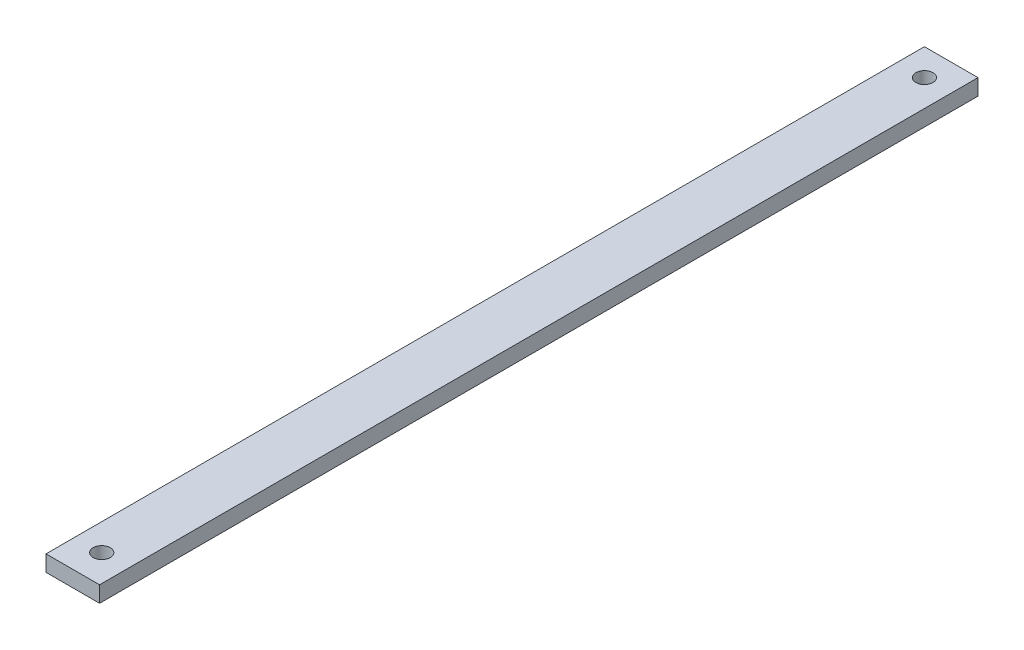
ISO-10303-21;
HEADER;
FILE_DESCRIPTION(('STEP AP214'),'2;1');
FILE_NAME('part.step','',(''),(''),'','','');
FILE_SCHEMA(('AUTOMOTIVE_DESIGN { 1 0 10303 214 1 1 1 1 }'));
ENDSEC;
DATA;
#1=APPLICATION_CONTEXT('core data for automotive mechanical design processes');
#2=APPLICATION_PROTOCOL_DEFINITION('international standard','automotive_design',2000,#1);
#3=PRODUCT_CONTEXT('',#1,'mechanical');
#4=PRODUCT('Part','Part','',(#3));
#5=PRODUCT_RELATED_PRODUCT_CATEGORY('part','',(#4));
#6=PRODUCT_DEFINITION_FORMATION('','',#4);
#7=PRODUCT_DEFINITION_CONTEXT('part definition',#1,'design');
#8=PRODUCT_DEFINITION('design','',#6,#7);
#9=PRODUCT_DEFINITION_SHAPE('','',#8);
#10=(LENGTH_UNIT() NAMED_UNIT(*) SI_UNIT(.MILLI.,.METRE.));
#11=(NAMED_UNIT(*) PLANE_ANGLE_UNIT() SI_UNIT($,.RADIAN.));
#12=(NAMED_UNIT(*) SI_UNIT($,.STERADIAN.) SOLID_ANGLE_UNIT());
#13=UNCERTAINTY_MEASURE_WITH_UNIT(LENGTH_MEASURE(1.E-05),#10,'distance_accuracy_value','');
#14=(GEOMETRIC_REPRESENTATION_CONTEXT(3) GLOBAL_UNCERTAINTY_ASSIGNED_CONTEXT((#13)) GLOBAL_UNIT_ASSIGNED_CONTEXT((#10,
#11,#12)) REPRESENTATION_CONTEXT('',''));
#15=CARTESIAN_POINT('',(0.,0.,0.));
#16=DIRECTION('',(0.,0.,1.));
#17=DIRECTION('',(1.,0.,0.));
#18=AXIS2_PLACEMENT_3D('',#15,#16,#17);
#19=CARTESIAN_POINT('',(0.,3.,0.));
#20=DIRECTION('',(1.,0.,0.));
#21=DIRECTION('',(0.,0.,-1.));
#22=AXIS2_PLACEMENT_3D('',#19,#20,#21);
#23=PLANE('',#22);
#24=DIRECTION('',(0.,0.,1.));
#25=VECTOR('',#24,1.);
#26=CARTESIAN_POINT('',(0.,0.,0.));
#27=LINE('',#26,#25);
#28=CARTESIAN_POINT('',(0.,0.,-164.));
#29=VERTEX_POINT('',#28);
#30=CARTESIAN_POINT('',(0.,0.,0.));
#31=VERTEX_POINT('',#30);
#32=EDGE_CURVE('E110',#29,#31,#27,.T.);
#33=ORIENTED_EDGE('',*,*,#32,.T.);
#34=DIRECTION('',(0.,-1.,0.));
#35=VECTOR('',#34,1.);
#36=CARTESIAN_POINT('',(0.,3.,0.));
#37=LINE('',#36,#35);
#38=CARTESIAN_POINT('',(0.,3.,0.));
#39=VERTEX_POINT('',#38);
#40=EDGE_CURVE('E11',#39,#31,#37,.T.);
#41=ORIENTED_EDGE('',*,*,#40,.F.);
#42=DIRECTION('',(0.,0.,1.));
#43=VECTOR('',#42,1.);
#44=CARTESIAN_POINT('',(0.,3.,0.));
#45=LINE('',#44,#43);
#46=CARTESIAN_POINT('',(0.,3.,-164.));
#47=VERTEX_POINT('',#46);
#48=EDGE_CURVE('E93',#47,#39,#45,.T.);
#49=ORIENTED_EDGE('',*,*,#48,.F.);
#50=DIRECTION('',(0.,-1.,0.));
#51=VECTOR('',#50,1.);
#52=CARTESIAN_POINT('',(0.,3.,-164.));
#53=LINE('',#52,#51);
#54=EDGE_CURVE('E106',#47,#29,#53,.T.);
#55=ORIENTED_EDGE('',*,*,#54,.T.);
#56=EDGE_LOOP('',(#33,#41,#49,#55));
#57=FACE_BOUND('',#56,.T.);
#58=ADVANCED_FACE('F39',(#57),#23,.F.);
#59=CARTESIAN_POINT('',(0.,3.,0.));
#60=DIRECTION('',(0.,0.,-1.));
#61=DIRECTION('',(-1.,0.,0.));
#62=AXIS2_PLACEMENT_3D('',#59,#60,#61);
#63=PLANE('',#62);
#64=DIRECTION('',(1.,0.,0.));
#65=VECTOR('',#64,1.);
#66=CARTESIAN_POINT('',(0.,0.,0.));
#67=LINE('',#66,#65);
#68=CARTESIAN_POINT('',(10.,0.,0.));
#69=VERTEX_POINT('',#68);
#70=EDGE_CURVE('E98',#31,#69,#67,.T.);
#71=ORIENTED_EDGE('',*,*,#70,.T.);
#72=DIRECTION('',(0.,-1.,0.));
#73=VECTOR('',#72,1.);
#74=CARTESIAN_POINT('',(10.,3.,0.));
#75=LINE('',#74,#73);
#76=CARTESIAN_POINT('',(10.,3.,0.));
#77=VERTEX_POINT('',#76);
#78=EDGE_CURVE('E49',#77,#69,#75,.T.);
#79=ORIENTED_EDGE('',*,*,#78,.F.);
#80=DIRECTION('',(1.,0.,0.));
#81=VECTOR('',#80,1.);
#82=CARTESIAN_POINT('',(0.,3.,0.));
#83=LINE('',#82,#81);
#84=EDGE_CURVE('E88',#39,#77,#83,.T.);
#85=ORIENTED_EDGE('',*,*,#84,.F.);
#86=ORIENTED_EDGE('',*,*,#40,.T.);
#87=EDGE_LOOP('',(#71,#79,#85,#86));
#88=FACE_BOUND('',#87,.T.);
#89=ADVANCED_FACE('F97',(#88),#63,.F.);
#90=CARTESIAN_POINT('',(10.,3.,0.));
#91=DIRECTION('',(-1.,0.,0.));
#92=DIRECTION('',(0.,0.,1.));
#93=AXIS2_PLACEMENT_3D('',#90,#91,#92);
#94=PLANE('',#93);
#95=DIRECTION('',(0.,0.,-1.));
#96=VECTOR('',#95,1.);
#97=CARTESIAN_POINT('',(10.,0.,0.));
#98=LINE('',#97,#96);
#99=CARTESIAN_POINT('',(9.99999999999997,0.,-164.));
#100=VERTEX_POINT('',#99);
#101=EDGE_CURVE('E75',#69,#100,#98,.T.);
#102=ORIENTED_EDGE('',*,*,#101,.T.);
#103=DIRECTION('',(0.,-1.,0.));
#104=VECTOR('',#103,1.);
#105=CARTESIAN_POINT('',(9.99999999999997,3.,-164.));
#106=LINE('',#105,#104);
#107=CARTESIAN_POINT('',(9.99999999999997,3.,-164.));
#108=VERTEX_POINT('',#107);
#109=EDGE_CURVE('E100',#108,#100,#106,.T.);
#110=ORIENTED_EDGE('',*,*,#109,.F.);
#111=DIRECTION('',(0.,0.,-1.));
#112=VECTOR('',#111,1.);
#113=CARTESIAN_POINT('',(10.,3.,0.));
#114=LINE('',#113,#112);
#115=EDGE_CURVE('E91',#77,#108,#114,.T.);
#116=ORIENTED_EDGE('',*,*,#115,.F.);
#117=ORIENTED_EDGE('',*,*,#78,.T.);
#118=EDGE_LOOP('',(#102,#110,#116,#117));
#119=FACE_BOUND('',#118,.T.);
#120=ADVANCED_FACE('F102',(#119),#94,.F.);
#121=CARTESIAN_POINT('',(0.,3.,-164.));
#122=DIRECTION('',(0.,0.,1.));
#123=DIRECTION('',(1.,0.,0.));
#124=AXIS2_PLACEMENT_3D('',#121,#122,#123);
#125=PLANE('',#124);
#126=DIRECTION('',(-1.,0.,0.));
#127=VECTOR('',#126,1.);
#128=CARTESIAN_POINT('',(0.,0.,-164.));
#129=LINE('',#128,#127);
#130=EDGE_CURVE('E81',#100,#29,#129,.T.);
#131=ORIENTED_EDGE('',*,*,#130,.T.);
#132=ORIENTED_EDGE('',*,*,#54,.F.);
#133=DIRECTION('',(-1.,0.,0.));
#134=VECTOR('',#133,1.);
#135=CARTESIAN_POINT('',(0.,3.,-164.));
#136=LINE('',#135,#134);
#137=EDGE_CURVE('E58',#108,#47,#136,.T.);
#138=ORIENTED_EDGE('',*,*,#137,.F.);
#139=ORIENTED_EDGE('',*,*,#109,.T.);
#140=EDGE_LOOP('',(#131,#132,#138,#139));
#141=FACE_BOUND('',#140,.T.);
#142=ADVANCED_FACE('F147',(#141),#125,.F.);
#143=CARTESIAN_POINT('',(0.,3.,0.));
#144=DIRECTION('',(0.,-1.,0.));
#145=DIRECTION('',(0.,0.,-1.));
#146=AXIS2_PLACEMENT_3D('',#143,#144,#145);
#147=PLANE('',#146);
#148=CARTESIAN_POINT('',(5.,3.,-159.));
#149=DIRECTION('',(0.,1.,0.));
#150=DIRECTION('',(0.,0.,1.));
#151=AXIS2_PLACEMENT_3D('',#148,#149,#150);
#152=CIRCLE('',#151,1.59999999999999);
#153=CARTESIAN_POINT('',(5.,3.,-157.4));
#154=VERTEX_POINT('',#153);
#155=EDGE_CURVE('E126',#154,#154,#152,.T.);
#156=ORIENTED_EDGE('',*,*,#155,.F.);
#157=EDGE_LOOP('',(#156));
#158=FACE_BOUND('',#157,.T.);
#159=CARTESIAN_POINT('',(4.99999999999997,3.,-5.40000000000002));
#160=DIRECTION('',(0.,1.,0.));
#161=DIRECTION('',(0.,0.,1.));
#162=AXIS2_PLACEMENT_3D('',#159,#160,#161);
#163=CIRCLE('',#162,1.6);
#164=CARTESIAN_POINT('',(4.99999999999997,3.,-3.80000000000002));
#165=VERTEX_POINT('',#164);
#166=EDGE_CURVE('E133',#165,#165,#163,.T.);
#167=ORIENTED_EDGE('',*,*,#166,.F.);
#168=EDGE_LOOP('',(#167));
#169=FACE_BOUND('',#168,.T.);
#170=ORIENTED_EDGE('',*,*,#48,.T.);
#171=ORIENTED_EDGE('',*,*,#84,.T.);
#172=ORIENTED_EDGE('',*,*,#115,.T.);
#173=ORIENTED_EDGE('',*,*,#137,.T.);
#174=EDGE_LOOP('',(#170,#171,#172,#173));
#175=FACE_BOUND('',#174,.T.);
#176=ADVANCED_FACE('F89',(#158,#169,#175),#147,.F.);
#177=CARTESIAN_POINT('',(0.,0.,0.));
#178=DIRECTION('',(0.,-1.,0.));
#179=DIRECTION('',(0.,0.,-1.));
#180=AXIS2_PLACEMENT_3D('',#177,#178,#179);
#181=PLANE('',#180);
#182=CARTESIAN_POINT('',(5.,0.,-159.));
#183=DIRECTION('',(0.,-1.,0.));
#184=DIRECTION('',(0.,0.,-1.));
#185=AXIS2_PLACEMENT_3D('',#182,#183,#184);
#186=CIRCLE('',#185,1.59999999999999);
#187=CARTESIAN_POINT('',(5.,0.,-160.6));
#188=VERTEX_POINT('',#187);
#189=EDGE_CURVE('E42',#188,#188,#186,.T.);
#190=ORIENTED_EDGE('',*,*,#189,.F.);
#191=EDGE_LOOP('',(#190));
#192=FACE_BOUND('',#191,.T.);
#193=CARTESIAN_POINT('',(4.99999999999997,0.,-5.40000000000002));
#194=DIRECTION('',(0.,-1.,0.));
#195=DIRECTION('',(0.,0.,-1.));
#196=AXIS2_PLACEMENT_3D('',#193,#194,#195);
#197=CIRCLE('',#196,1.6);
#198=CARTESIAN_POINT('',(4.99999999999997,0.,-7.00000000000002));
#199=VERTEX_POINT('',#198);
#200=EDGE_CURVE('E123',#199,#199,#197,.T.);
#201=ORIENTED_EDGE('',*,*,#200,.F.);
#202=EDGE_LOOP('',(#201));
#203=FACE_BOUND('',#202,.T.);
#204=ORIENTED_EDGE('',*,*,#32,.F.);
#205=ORIENTED_EDGE('',*,*,#130,.F.);
#206=ORIENTED_EDGE('',*,*,#101,.F.);
#207=ORIENTED_EDGE('',*,*,#70,.F.);
#208=EDGE_LOOP('',(#204,#205,#206,#207));
#209=FACE_BOUND('',#208,.T.);
#210=ADVANCED_FACE('F146',(#192,#203,#209),#181,.T.);
#211=CARTESIAN_POINT('',(4.99999999999997,-7.,-5.40000000000002));
#212=DIRECTION('',(0.,1.,0.));
#213=DIRECTION('',(0.,0.,1.));
#214=AXIS2_PLACEMENT_3D('',#211,#212,#213);
#215=CYLINDRICAL_SURFACE('',#214,1.6);
#216=ORIENTED_EDGE('',*,*,#200,.T.);
#217=EDGE_LOOP('',(#216));
#218=FACE_BOUND('',#217,.T.);
#219=ORIENTED_EDGE('',*,*,#166,.T.);
#220=EDGE_LOOP('',(#219));
#221=FACE_BOUND('',#220,.T.);
#222=ADVANCED_FACE('F143',(#218,#221),#215,.F.);
#223=CARTESIAN_POINT('',(5.,-7.,-159.));
#224=DIRECTION('',(0.,1.,0.));
#225=DIRECTION('',(0.,0.,1.));
#226=AXIS2_PLACEMENT_3D('',#223,#224,#225);
#227=CYLINDRICAL_SURFACE('',#226,1.59999999999999);
#228=ORIENTED_EDGE('',*,*,#189,.T.);
#229=EDGE_LOOP('',(#228));
#230=FACE_BOUND('',#229,.T.);
#231=ORIENTED_EDGE('',*,*,#155,.T.);
#232=EDGE_LOOP('',(#231));
#233=FACE_BOUND('',#232,.T.);
#234=ADVANCED_FACE('F194',(#230,#233),#227,.F.);
#235=CLOSED_SHELL('',(#58,#89,#120,#142,#176,#210,#222,#234));
#236=MANIFOLD_SOLID_BREP('B2',#235);
#237=ADVANCED_BREP_SHAPE_REPRESENTATION('',(#18,#236),#14);
#238=SHAPE_DEFINITION_REPRESENTATION(#9,#237);
ENDSEC;
END-ISO-10303-21;
